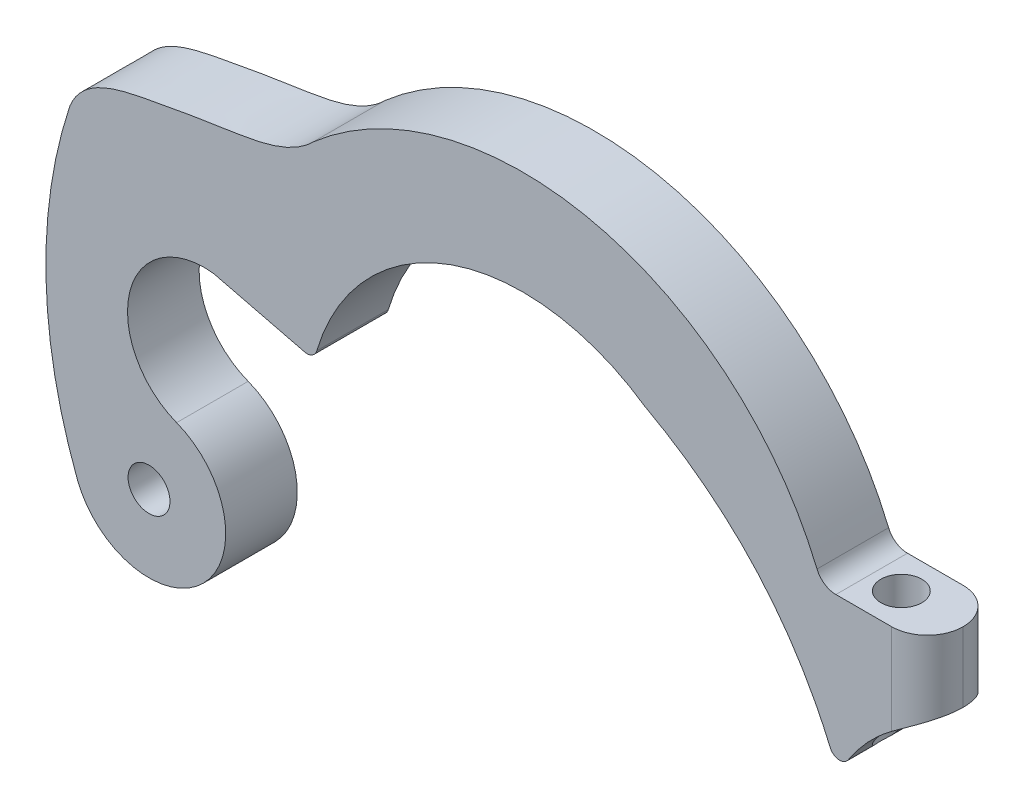
ISO-10303-21;
HEADER;
FILE_DESCRIPTION(('STEP AP214'),'2;1');
FILE_NAME('part.step','',(''),(''),'','','');
FILE_SCHEMA(('AUTOMOTIVE_DESIGN { 1 0 10303 214 1 1 1 1 }'));
ENDSEC;
DATA;
#1=APPLICATION_CONTEXT('core data for automotive mechanical design processes');
#2=APPLICATION_PROTOCOL_DEFINITION('international standard','automotive_design',2000,#1);
#3=PRODUCT_CONTEXT('',#1,'mechanical');
#4=PRODUCT('Part','Part','',(#3));
#5=PRODUCT_RELATED_PRODUCT_CATEGORY('part','',(#4));
#6=PRODUCT_DEFINITION_FORMATION('','',#4);
#7=PRODUCT_DEFINITION_CONTEXT('part definition',#1,'design');
#8=PRODUCT_DEFINITION('design','',#6,#7);
#9=PRODUCT_DEFINITION_SHAPE('','',#8);
#10=(LENGTH_UNIT() NAMED_UNIT(*) SI_UNIT(.MILLI.,.METRE.));
#11=(NAMED_UNIT(*) PLANE_ANGLE_UNIT() SI_UNIT($,.RADIAN.));
#12=(NAMED_UNIT(*) SI_UNIT($,.STERADIAN.) SOLID_ANGLE_UNIT());
#13=UNCERTAINTY_MEASURE_WITH_UNIT(LENGTH_MEASURE(1.E-05),#10,'distance_accuracy_value','');
#14=(GEOMETRIC_REPRESENTATION_CONTEXT(3) GLOBAL_UNCERTAINTY_ASSIGNED_CONTEXT((#13)) GLOBAL_UNIT_ASSIGNED_CONTEXT((#10,
#11,#12)) REPRESENTATION_CONTEXT('',''));
#15=CARTESIAN_POINT('',(0.,0.,0.));
#16=DIRECTION('',(0.,0.,1.));
#17=DIRECTION('',(1.,0.,0.));
#18=AXIS2_PLACEMENT_3D('',#15,#16,#17);
#19=CARTESIAN_POINT('',(17.2001521655852,23.6219728879206,7.));
#20=CARTESIAN_POINT('',(20.0814505358604,29.2897586581277,7.));
#21=CARTESIAN_POINT('',(25.9470319855295,31.9346468589773,7.));
#22=B_SPLINE_CURVE_WITH_KNOTS('',2,(#19,#20,#21),.UNSPECIFIED.,.F.,.F.,(3,3),(0.,1.),.UNSPECIFIED.);
#23=DIRECTION('',(0.,0.,-1.));
#24=VECTOR('',#23,1.);
#25=SURFACE_OF_LINEAR_EXTRUSION('',#22,#24);
#26=CARTESIAN_POINT('',(18.2015927497313,25.3629493457996,7.));
#27=VERTEX_POINT('',#26);
#28=CARTESIAN_POINT('',(22.4470319825975,29.8942588678734,7.));
#29=VERTEX_POINT('',#28);
#30=EDGE_CURVE('E224',#27,#29,#22,.T.);
#31=ORIENTED_EDGE('',*,*,#30,.F.);
#32=DIRECTION('',(0.,0.,-1.));
#33=VECTOR('',#32,1.);
#34=CARTESIAN_POINT('',(18.2015927497313,25.3629493457996,7.));
#35=LINE('',#34,#33);
#36=CARTESIAN_POINT('',(18.2015927497313,25.3629493457996,4.56154111654515));
#37=VERTEX_POINT('',#36);
#38=EDGE_CURVE('E303',#27,#37,#35,.T.);
#39=ORIENTED_EDGE('',*,*,#38,.T.);
#40=CARTESIAN_POINT('',(19.8966238579661,27.5776782801847,5.49999999999994));
#41=CARTESIAN_POINT('',(19.8098926829241,27.4813550935762,5.49999884020681));
#42=CARTESIAN_POINT('',(19.7242840393373,27.3840828251902,5.494369848892));
#43=CARTESIAN_POINT('',(19.5558020947176,27.1882775001092,5.47257673416799));
#44=CARTESIAN_POINT('',(19.4729300030787,27.0897439119877,5.45640801659684));
#45=CARTESIAN_POINT('',(19.3102973129015,26.8920129658044,5.41397424073153));
#46=CARTESIAN_POINT('',(19.230542238776,26.7928147645443,5.38769207907494));
#47=CARTESIAN_POINT('',(19.0747086785046,26.5946873592197,5.32524012173544));
#48=CARTESIAN_POINT('',(18.9986288535112,26.495758069779,5.28907395912586));
#49=CARTESIAN_POINT('',(18.868658179066,26.3230958356867,5.2167934700012));
#50=CARTESIAN_POINT('',(18.8138905650203,26.2491169720247,5.18282892510963));
#51=CARTESIAN_POINT('',(18.7069025780289,26.1022926110442,5.10897152677311));
#52=CARTESIAN_POINT('',(18.6546816873473,26.0294468854325,5.06907988500566));
#53=CARTESIAN_POINT('',(18.5532024831045,25.8856985592782,4.9831152856463));
#54=CARTESIAN_POINT('',(18.5039365737164,25.8147912563204,4.93705925487743));
#55=CARTESIAN_POINT('',(18.408653494581,25.6756270117407,4.8381545249466));
#56=CARTESIAN_POINT('',(18.362634221073,25.6073683669847,4.78531028822642));
#57=CARTESIAN_POINT('',(18.2725395816646,25.4718806292134,4.66959891305477));
#58=CARTESIAN_POINT('',(18.2286315437233,25.4048204399131,4.60639975674109));
#59=CARTESIAN_POINT('',(18.146110520583,25.2771378330396,4.47057378965409));
#60=CARTESIAN_POINT('',(18.1074948341296,25.2165121348473,4.39795182547635));
#61=CARTESIAN_POINT('',(18.0448854667269,25.1171412603727,4.25867576819575));
#62=CARTESIAN_POINT('',(18.0195277124606,25.0764827170088,4.19402392048638));
#63=CARTESIAN_POINT('',(17.9747080337151,25.0041250659171,4.05797773770221));
#64=CARTESIAN_POINT('',(17.9552344487556,24.9724082471149,3.98659711026856));
#65=CARTESIAN_POINT('',(17.9275701737178,24.9271561487168,3.85527490907849));
#66=CARTESIAN_POINT('',(17.9178078204189,24.9111065216248,3.79654272632062));
#67=CARTESIAN_POINT('',(17.9035410571101,24.8876135429762,3.67676440503316));
#68=CARTESIAN_POINT('',(17.8990311319844,24.8801611642783,3.61572076325408));
#69=CARTESIAN_POINT('',(17.8956902931516,24.8746429872509,3.49284959214921));
#70=CARTESIAN_POINT('',(17.896877123769,24.8766065176925,3.43102021259559));
#71=CARTESIAN_POINT('',(17.9048467196601,24.8897596516492,3.30871609741592));
#72=CARTESIAN_POINT('',(17.9116336211601,24.9009560745983,3.24824239702033));
#73=CARTESIAN_POINT('',(17.9320513652866,24.9344984242242,3.11843565398938));
#74=CARTESIAN_POINT('',(17.9467775158678,24.9586231567542,3.04974227017268));
#75=CARTESIAN_POINT('',(17.9820006692961,25.015913947458,2.91784534603719));
#76=CARTESIAN_POINT('',(18.002508618633,25.0490971519208,2.85465251965972));
#77=CARTESIAN_POINT('',(18.0601585346874,25.1415722089247,2.70175200913648));
#78=CARTESIAN_POINT('',(18.1003317991612,25.2053378414466,2.61593085352243));
#79=CARTESIAN_POINT('',(18.1880060658003,25.3422943610519,2.4564781474935));
#80=CARTESIAN_POINT('',(18.2355255591096,25.4155089530351,2.38287835677544));
#81=CARTESIAN_POINT('',(18.3293731746246,25.5576397999015,2.25536498026371));
#82=CARTESIAN_POINT('',(18.3750254503339,25.6258409538296,2.20013511779052));
#83=CARTESIAN_POINT('',(18.4697777076004,25.7652195051312,2.09677873850739));
#84=CARTESIAN_POINT('',(18.5188800711876,25.8363989447988,2.0486572020161));
#85=CARTESIAN_POINT('',(18.6201241064874,25.9808317650666,1.95885365963329));
#86=CARTESIAN_POINT('',(18.6722707555764,26.0540884353259,1.91718263076782));
#87=CARTESIAN_POINT('',(18.7792193540696,26.2018828334888,1.83995269205024));
#88=CARTESIAN_POINT('',(18.8340219105099,26.2764208517222,1.80439518803601));
#89=CARTESIAN_POINT('',(18.9650549516033,26.4516774411645,1.72807418348074));
#90=CARTESIAN_POINT('',(19.0422465241951,26.5526974709972,1.68963817810016));
#91=CARTESIAN_POINT('',(19.2005228619032,26.7551297172021,1.62308410663692));
#92=CARTESIAN_POINT('',(19.281609119316,26.8565420699908,1.5949700317736));
#93=CARTESIAN_POINT('',(19.4471718948321,27.0588506530818,1.54926666534657));
#94=CARTESIAN_POINT('',(19.5316456446983,27.1597472317935,1.5316689596432));
#95=CARTESIAN_POINT('',(19.7035063798126,27.3602866804758,1.50745623760402));
#96=CARTESIAN_POINT('',(19.7908921918074,27.4599300335993,1.50083685145606));
#97=CARTESIAN_POINT('',(20.0131262107082,27.7074800281364,1.49892183386271));
#98=CARTESIAN_POINT('',(20.1495135414186,27.8541635994848,1.51109590293243));
#99=CARTESIAN_POINT('',(20.4243570604005,28.1396513581589,1.56581500055806));
#100=CARTESIAN_POINT('',(20.5628091407869,28.2784690864153,1.60830601134042));
#101=CARTESIAN_POINT('',(20.7995576888863,28.5081862945729,1.71209029475802));
#102=CARTESIAN_POINT('',(20.8986391041876,28.6019320556064,1.76525303162586));
#103=CARTESIAN_POINT('',(21.0916571856414,28.7804994794568,1.8921465364551));
#104=CARTESIAN_POINT('',(21.1856000418898,28.8653319982926,1.96585187481622));
#105=CARTESIAN_POINT('',(21.3443958074552,29.0059148115849,2.11680206659949));
#106=CARTESIAN_POINT('',(21.4111546455624,29.0639925343239,2.18986056326153));
#107=CARTESIAN_POINT('',(21.5355986440519,29.1708059566397,2.34936665832165));
#108=CARTESIAN_POINT('',(21.5932940290087,29.2195521969321,2.43579894781719));
#109=CARTESIAN_POINT('',(21.6880795608943,29.2987964339306,2.60633071419185));
#110=CARTESIAN_POINT('',(21.7269849658425,29.3309606776939,2.68864173182495));
#111=CARTESIAN_POINT('',(21.793884876017,29.3859123330619,2.8605539056587));
#112=CARTESIAN_POINT('',(21.8218837477594,29.4087034974568,2.95015212696756));
#113=CARTESIAN_POINT('',(21.8652957415686,29.4439160032572,3.13480935068443));
#114=CARTESIAN_POINT('',(21.8806490497705,29.456288068156,3.2298920547592));
#115=CARTESIAN_POINT('',(21.897428266481,29.4698049782703,3.42206619153532));
#116=CARTESIAN_POINT('',(21.8988583932892,29.4709532239614,3.51915700690592));
#117=CARTESIAN_POINT('',(21.8881719849134,29.4623494405819,3.70391823669822));
#118=CARTESIAN_POINT('',(21.8771742760756,29.453497688628,3.79169950916133));
#119=CARTESIAN_POINT('',(21.8440982300006,29.4267387259904,3.96369525385861));
#120=CARTESIAN_POINT('',(21.822020028104,29.4088316259115,4.04790976964466));
#121=CARTESIAN_POINT('',(21.7675596771128,29.3643320204434,4.21219571078722));
#122=CARTESIAN_POINT('',(21.7350055126082,29.3375943084381,4.29216998604148));
#123=CARTESIAN_POINT('',(21.6613635305606,29.2765286173168,4.44493009916874));
#124=CARTESIAN_POINT('',(21.6202732207643,29.2421984212738,4.51771382847787));
#125=CARTESIAN_POINT('',(21.5258081385958,29.1623836966997,4.66370959958499));
#126=CARTESIAN_POINT('',(21.4715442890915,29.1160468858402,4.73587523278912));
#127=CARTESIAN_POINT('',(21.3566344463599,29.0165064858546,4.86973290128619));
#128=CARTESIAN_POINT('',(21.2959793484576,28.9632930755487,4.93140965878472));
#129=CARTESIAN_POINT('',(21.1849362989382,28.8643508018315,5.03116108172517));
#130=CARTESIAN_POINT('',(21.1354398479284,28.8197581302734,5.07138926888604));
#131=CARTESIAN_POINT('',(21.0346479702629,28.7278298527731,5.14585040693285));
#132=CARTESIAN_POINT('',(20.9833540651065,28.6804965455777,5.18008828803301));
#133=CARTESIAN_POINT('',(20.8274480996093,28.5347756655496,5.27435522546337));
#134=CARTESIAN_POINT('',(20.7209502800146,28.4327897382292,5.32581767506901));
#135=CARTESIAN_POINT('',(20.4936537304065,28.2091531754158,5.41315985382582));
#136=CARTESIAN_POINT('',(20.3727120631309,28.0866289545604,5.44633280788809));
#137=CARTESIAN_POINT('',(20.1327065537732,27.8358733189006,5.48975822332967));
#138=CARTESIAN_POINT('',(20.013643477559,27.7076396539288,5.50000156481848));
#139=CARTESIAN_POINT('',(19.8966238579661,27.5776782801847,5.49999999999994));
#140=B_SPLINE_CURVE_WITH_KNOTS('',3,(#40,#41,#42,#43,#44,#45,#46,#47,#48,#49,#50,#51,#52,#53,
#54,#55,#56,#57,#58,#59,#60,#61,#62,#63,#64,#65,#66,#67,#68,#69,#70,#71,#72,#73,#74,#75,#76,#77,
#78,#79,#80,#81,#82,#83,#84,#85,#86,#87,#88,#89,#90,#91,#92,#93,#94,#95,#96,#97,#98,#99,#100,
#101,#102,#103,#104,#105,#106,#107,#108,#109,#110,#111,#112,#113,#114,#115,#116,#117,#118,#119,
#120,#121,#122,#123,#124,#125,#126,#127,#128,#129,#130,#131,#132,#133,#134,#135,#136,#137,#138,
#139),.UNSPECIFIED.,.T.,.F.,(4,2,2,2,2,2,2,2,2,2,2,2,2,2,2,2,2,2,2,2,2,2,2,2,2,2,2,2,2,2,2,2,2,
2,2,2,2,2,2,2,2,2,2,2,2,2,2,2,2,4),(0.,0.388659282770202,0.777488091646844,1.16697737941653,
1.55632369427737,1.85046526822323,2.14454679327757,2.4378367597651,2.73093490015948,
3.03656910823861,3.34204673278144,3.58271989457953,3.82291294563747,4.0071464351827,
4.19118630233214,4.3757997904351,4.56054975671111,4.78216011423593,5.0041928899157,
5.34493001872175,5.68653921522483,5.98290200360533,6.27947145820034,6.57654017361641,
6.8736771104781,7.27163810976643,7.66975282845396,8.06754858787444,8.46518597056992,
9.06502155888429,9.66379103945124,10.1015197676678,10.5387090217714,10.8816753621772,
11.2242519764011,11.5127104284992,11.8010532750072,12.0907522831789,12.3803635186456,
12.6458433291068,12.911319896992,13.1813993649301,13.4515577976525,13.7549139503303,
14.0587082470938,14.2918733341028,14.5248456066793,14.9914431022406,15.5156223555133,
16.040010055772),.UNSPECIFIED.);
#141=CARTESIAN_POINT('',(18.2015927497313,25.3629493457996,2.43845888345488));
#142=VERTEX_POINT('',#141);
#143=EDGE_CURVE('E230',#142,#37,#140,.T.);
#144=ORIENTED_EDGE('',*,*,#143,.F.);
#145=DIRECTION('',(0.,0.,-1.));
#146=VECTOR('',#145,1.);
#147=CARTESIAN_POINT('',(18.2015927497313,25.3629493457996,7.));
#148=LINE('',#147,#146);
#149=CARTESIAN_POINT('',(18.2015927497313,25.3629493457996,0.));
#150=VERTEX_POINT('',#149);
#151=EDGE_CURVE('E301',#142,#150,#148,.T.);
#152=ORIENTED_EDGE('',*,*,#151,.T.);
#153=CARTESIAN_POINT('',(17.2001521655852,23.6219728879206,0.));
#154=CARTESIAN_POINT('',(20.0814505358604,29.2897586581277,0.));
#155=CARTESIAN_POINT('',(25.9470319855295,31.9346468589773,0.));
#156=B_SPLINE_CURVE_WITH_KNOTS('',2,(#153,#154,#155),.UNSPECIFIED.,.F.,.F.,(3,3),(0.,1.),.UNSPECIFIED.);
#157=CARTESIAN_POINT('',(22.4470319825975,29.8942588678734,0.));
#158=VERTEX_POINT('',#157);
#159=EDGE_CURVE('E351',#150,#158,#156,.T.);
#160=ORIENTED_EDGE('',*,*,#159,.T.);
#161=CARTESIAN_POINT('',(22.4470319855295,29.8942588639167,0.));
#162=CARTESIAN_POINT('',(22.5665554976981,29.9828795206211,-5.56647734688034E-06));
#163=CARTESIAN_POINT('',(22.6872843484666,30.0699946104767,0.00612461249474137));
#164=CARTESIAN_POINT('',(22.9301708367813,30.2407265825517,0.0313539204566733));
#165=CARTESIAN_POINT('',(23.0523306616043,30.3243368603296,0.0504764600029265));
#166=CARTESIAN_POINT('',(23.2971482356552,30.4875750492338,0.102497350988091));
#167=CARTESIAN_POINT('',(23.4198060104082,30.5671855810638,0.135450827783652));
#168=CARTESIAN_POINT('',(23.6634970103085,30.7213447167459,0.215697210156675));
#169=CARTESIAN_POINT('',(23.7845315714496,30.795897718253,0.262977457450226));
#170=CARTESIAN_POINT('',(23.9896542660832,30.919155522692,0.356877052466896));
#171=CARTESIAN_POINT('',(24.0745587302664,30.9692324441137,0.399941646130459));
#172=CARTESIAN_POINT('',(24.2418942613739,31.0662324165186,0.493729391709691));
#173=CARTESIAN_POINT('',(24.3243258780141,31.1131561713729,0.544450826151649));
#174=CARTESIAN_POINT('',(24.48576344269,31.2035399729088,0.653416333201437));
#175=CARTESIAN_POINT('',(24.5647761255619,31.2470069851313,0.711644624349409));
#176=CARTESIAN_POINT('',(24.7186903548014,31.3303606858652,0.835544576196664));
#177=CARTESIAN_POINT('',(24.7935938254376,31.3702490558464,0.901212708024677));
#178=CARTESIAN_POINT('',(24.9389460281684,31.446527577507,1.04021520638064));
#179=CARTESIAN_POINT('',(25.0093627593528,31.4828933939603,1.11359647883229));
#180=CARTESIAN_POINT('',(25.1443078165034,31.5516480474322,1.26725442575238));
#181=CARTESIAN_POINT('',(25.2088387157219,31.5840386245638,1.34752805683152));
#182=CARTESIAN_POINT('',(25.3312557900454,31.6447440319733,1.51455710485005));
#183=CARTESIAN_POINT('',(25.3891360852498,31.6730552611689,1.60131814724438));
#184=CARTESIAN_POINT('',(25.4973844000389,31.7254462401881,1.78060709870666));
#185=CARTESIAN_POINT('',(25.5477534424748,31.7495265662385,1.87313422013631));
#186=CARTESIAN_POINT('',(25.6357853198476,31.7912411475059,2.05398262167136));
#187=CARTESIAN_POINT('',(25.6742061395618,31.8092737402666,2.14184405414431));
#188=CARTESIAN_POINT('',(25.743878111223,31.8417593441568,2.32100017802681));
#189=CARTESIAN_POINT('',(25.7751300174297,31.8562127318764,2.41229450707505));
#190=CARTESIAN_POINT('',(25.8300393517409,31.8814805806018,2.59746320700012));
#191=CARTESIAN_POINT('',(25.8537091290955,31.8923009602004,2.691333109379));
#192=CARTESIAN_POINT('',(25.8932220579867,31.9103034448264,2.88100764411741));
#193=CARTESIAN_POINT('',(25.9090691984939,31.917487404209,2.97681126442575));
#194=CARTESIAN_POINT('',(25.9296063175659,31.9267821319608,3.14396438681614));
#195=CARTESIAN_POINT('',(25.9361421056709,31.9297337326443,3.21504694174019));
#196=CARTESIAN_POINT('',(25.9448534568388,31.9336645119566,3.35741717964341));
#197=CARTESIAN_POINT('',(25.9470360677028,31.9346468787911,3.42870434362669));
#198=CARTESIAN_POINT('',(25.9470319855295,31.9346468589773,3.5));
#199=B_SPLINE_CURVE_WITH_KNOTS('',3,(#161,#162,#163,#164,#165,#166,#167,#168,#169,#170,#171,
#172,#173,#174,#175,#176,#177,#178,#179,#180,#181,#182,#183,#184,#185,#186,#187,#188,#189,#190,
#191,#192,#193,#194,#195,#196,#197,#198),.UNSPECIFIED.,.F.,.F.,(4,2,2,2,2,2,2,2,2,2,2,2,2,2,2,2,
2,2,4),(0.,0.446350824528992,0.893508056072512,1.34246468550038,1.79102579442959,
2.11341714689362,2.4357362922668,2.75738855953018,3.07888889416988,3.40247189781508,
3.72591274783152,4.0496373916404,4.37331791163713,4.6656668246653,4.95798496479263,
5.24982454745425,5.54151515921833,5.75569247373219,5.96952275244164),.UNSPECIFIED.);
#200=CARTESIAN_POINT('',(25.9470319855295,31.9346468589773,3.5));
#201=VERTEX_POINT('',#200);
#202=EDGE_CURVE('E253',#158,#201,#199,.T.);
#203=ORIENTED_EDGE('',*,*,#202,.T.);
#204=CARTESIAN_POINT('',(25.9470319855295,31.9346468589773,3.5));
#205=CARTESIAN_POINT('',(25.9470461280311,31.9346480945641,3.59135616251538));
#206=CARTESIAN_POINT('',(25.9434557677776,31.9330341251254,3.68270902129284));
#207=CARTESIAN_POINT('',(25.9291693110547,31.9265851411146,3.86472579277713));
#208=CARTESIAN_POINT('',(25.918474582044,31.921750746414,3.95538983467226));
#209=CARTESIAN_POINT('',(25.8901179656057,31.9088863219072,4.13515799965357));
#210=CARTESIAN_POINT('',(25.8724735093792,31.9008642868504,4.22426544744259));
#211=CARTESIAN_POINT('',(25.8304133182699,31.8816419673842,4.40052109466693));
#212=CARTESIAN_POINT('',(25.8059972362911,31.8704415200568,4.48766919342348));
#213=CARTESIAN_POINT('',(25.7506574028257,31.8448884510903,4.65939521872141));
#214=CARTESIAN_POINT('',(25.7197338067114,31.8305359047097,4.7439732065711));
#215=CARTESIAN_POINT('',(25.6517147355872,31.798716975974,4.90998404931584));
#216=CARTESIAN_POINT('',(25.6146202136018,31.7812510744089,4.99141738747468));
#217=CARTESIAN_POINT('',(25.5346376640202,31.7432473887582,5.15064390907123));
#218=CARTESIAN_POINT('',(25.491749598767,31.7227095847057,5.228437068844));
#219=CARTESIAN_POINT('',(25.4006030653896,31.6786140414463,5.37996046651562));
#220=CARTESIAN_POINT('',(25.3523410076792,31.6550542820932,5.45368793896693));
#221=CARTESIAN_POINT('',(25.1978428934396,31.5787783305809,5.67143534668671));
#222=CARTESIAN_POINT('',(25.0837456750075,31.5213300777107,5.80836292810864));
#223=CARTESIAN_POINT('',(24.839397083887,31.3948031523493,6.06076087409481));
#224=CARTESIAN_POINT('',(24.7091357334685,31.3257172867399,6.17621787442759));
#225=CARTESIAN_POINT('',(24.4999498765983,31.2113377942515,6.33620329110977));
#226=CARTESIAN_POINT('',(24.4250702171276,31.1697743088706,6.38887834765963));
#227=CARTESIAN_POINT('',(24.2726871030907,31.0837809921423,6.48750803592483));
#228=CARTESIAN_POINT('',(24.19518623949,31.0393539541061,6.53346907814828));
#229=CARTESIAN_POINT('',(24.0379868144756,30.9476933640541,6.61879478009944));
#230=CARTESIAN_POINT('',(23.9582840053371,30.9004541501809,6.65814547773572));
#231=CARTESIAN_POINT('',(23.7974140851099,30.8034326294983,6.73020721818906));
#232=CARTESIAN_POINT('',(23.7162465807362,30.7536496328829,6.76291644792888));
#233=CARTESIAN_POINT('',(23.5359469998773,30.6410893822705,6.82795248535166));
#234=CARTESIAN_POINT('',(23.4366063814197,30.5777711814764,6.85877008801705));
#235=CARTESIAN_POINT('',(23.2374668539806,30.4480561469204,6.91113146379967));
#236=CARTESIAN_POINT('',(23.137667813159,30.3816583701002,6.93267237506795));
#237=CARTESIAN_POINT('',(22.9387556148956,30.2463958896681,6.96674979196393));
#238=CARTESIAN_POINT('',(22.8396412815381,30.1775409155486,6.97931839834202));
#239=CARTESIAN_POINT('',(22.6424362388268,30.0375420410932,6.99594074170432));
#240=CARTESIAN_POINT('',(22.5443447578236,29.9664000609687,7.00000144179864));
#241=CARTESIAN_POINT('',(22.4470319829132,29.8942588681074,7.));
#242=B_SPLINE_CURVE_WITH_KNOTS('',3,(#204,#205,#206,#207,#208,#209,#210,#211,#212,#213,#214,
#215,#216,#217,#218,#219,#220,#221,#222,#223,#224,#225,#226,#227,#228,#229,#230,#231,#232,#233,
#234,#235,#236,#237,#238,#239,#240,#241),.UNSPECIFIED.,.F.,.F.,(4,2,2,2,2,2,2,2,2,2,2,2,2,2,2,2,
2,2,4),(0.,0.273978714324463,0.547904708120585,0.821147975825001,1.094405251862,
1.36765600440066,1.64086459579964,1.9140749630918,2.18746892997172,2.74667613330865,
3.30623025512171,3.60760339866438,3.90868688499102,4.21039852207887,4.51219241405476,
4.87707211389954,5.24206429822885,5.6057439930229,5.96912592565886),.UNSPECIFIED.);
#243=EDGE_CURVE('E266',#201,#29,#242,.T.);
#244=ORIENTED_EDGE('',*,*,#243,.T.);
#245=EDGE_LOOP('',(#31,#39,#144,#152,#160,#203,#244));
#246=FACE_BOUND('',#245,.T.);
#247=ADVANCED_FACE('F46',(#246),#25,.F.);
#248=CARTESIAN_POINT('',(0.,38.7608488072893,7.));
#249=DIRECTION('',(0.,1.,0.));
#250=DIRECTION('',(0.,0.,1.));
#251=AXIS2_PLACEMENT_3D('',#248,#249,#250);
#252=PLANE('',#251);
#253=CARTESIAN_POINT('',(19.8966238579661,38.7608488072893,3.50000000000001));
#254=DIRECTION('',(0.,1.,0.));
#255=DIRECTION('',(0.,0.,1.));
#256=AXIS2_PLACEMENT_3D('',#253,#254,#255);
#257=CIRCLE('',#256,1.99999999999993);
#258=CARTESIAN_POINT('',(19.8966238579661,38.7608488072893,5.49999999999994));
#259=VERTEX_POINT('',#258);
#260=EDGE_CURVE('E427',#259,#259,#257,.F.);
#261=ORIENTED_EDGE('',*,*,#260,.T.);
#262=EDGE_LOOP('',(#261));
#263=FACE_BOUND('',#262,.T.);
#264=DIRECTION('',(1.,0.,0.));
#265=VECTOR('',#264,1.);
#266=CARTESIAN_POINT('',(0.,38.7608488072893,0.));
#267=LINE('',#266,#265);
#268=CARTESIAN_POINT('',(16.9973650923728,38.7608488072893,0.));
#269=VERTEX_POINT('',#268);
#270=CARTESIAN_POINT('',(22.4470319855295,38.7608488072893,0.));
#271=VERTEX_POINT('',#270);
#272=EDGE_CURVE('E355',#269,#271,#267,.T.);
#273=ORIENTED_EDGE('',*,*,#272,.F.);
#274=DIRECTION('',(0.,0.,1.));
#275=VECTOR('',#274,1.);
#276=CARTESIAN_POINT('',(16.9973650923728,38.7608488072893,7.));
#277=LINE('',#276,#275);
#278=CARTESIAN_POINT('',(16.9973650923728,38.7608488072893,7.));
#279=VERTEX_POINT('',#278);
#280=EDGE_CURVE('E245',#269,#279,#277,.T.);
#281=ORIENTED_EDGE('',*,*,#280,.T.);
#282=DIRECTION('',(1.,0.,0.));
#283=VECTOR('',#282,1.);
#284=CARTESIAN_POINT('',(0.,38.7608488072893,7.));
#285=LINE('',#284,#283);
#286=CARTESIAN_POINT('',(22.4470319855295,38.7608488072893,7.));
#287=VERTEX_POINT('',#286);
#288=EDGE_CURVE('E186',#279,#287,#285,.T.);
#289=ORIENTED_EDGE('',*,*,#288,.T.);
#290=CARTESIAN_POINT('',(22.4470319855295,38.7608488072893,3.5));
#291=DIRECTION('',(0.,1.,0.));
#292=DIRECTION('',(0.,0.,1.));
#293=AXIS2_PLACEMENT_3D('',#290,#291,#292);
#294=CIRCLE('',#293,3.5);
#295=CARTESIAN_POINT('',(25.9470319855295,38.7608488072893,3.5));
#296=VERTEX_POINT('',#295);
#297=EDGE_CURVE('E173',#287,#296,#294,.T.);
#298=ORIENTED_EDGE('',*,*,#297,.T.);
#299=CARTESIAN_POINT('',(22.4470319855295,38.7608488072893,3.5));
#300=DIRECTION('',(0.,1.,0.));
#301=DIRECTION('',(0.,0.,1.));
#302=AXIS2_PLACEMENT_3D('',#299,#300,#301);
#303=CIRCLE('',#302,3.5);
#304=EDGE_CURVE('E259',#296,#271,#303,.T.);
#305=ORIENTED_EDGE('',*,*,#304,.T.);
#306=EDGE_LOOP('',(#273,#281,#289,#298,#305));
#307=FACE_BOUND('',#306,.T.);
#308=ADVANCED_FACE('F209',(#263,#307),#252,.T.);
#309=CARTESIAN_POINT('',(-13.629752375995,28.0761266747868,7.));
#310=DIRECTION('',(0.,0.,-1.));
#311=DIRECTION('',(-1.,0.,0.));
#312=AXIS2_PLACEMENT_3D('',#309,#310,#311);
#313=CYLINDRICAL_SURFACE('',#312,31.15);
#314=CARTESIAN_POINT('',(-13.629752375995,28.0761266747868,7.));
#315=DIRECTION('',(0.,0.,1.));
#316=DIRECTION('',(1.,0.,0.));
#317=AXIS2_PLACEMENT_3D('',#314,#315,#316);
#318=CIRCLE('',#317,31.15);
#319=CARTESIAN_POINT('',(-34.1005464957736,51.5552469331279,7.));
#320=VERTEX_POINT('',#319);
#321=CARTESIAN_POINT('',(15.1495751998619,39.9955563709392,7.));
#322=VERTEX_POINT('',#321);
#323=EDGE_CURVE('E165',#320,#322,#318,.F.);
#324=ORIENTED_EDGE('',*,*,#323,.T.);
#325=DIRECTION('',(0.,0.,-1.));
#326=VECTOR('',#325,1.);
#327=CARTESIAN_POINT('',(15.1495751998619,39.9955563709392,7.));
#328=LINE('',#327,#326);
#329=CARTESIAN_POINT('',(15.1495751998619,39.9955563709392,0.));
#330=VERTEX_POINT('',#329);
#331=EDGE_CURVE('E252',#322,#330,#328,.T.);
#332=ORIENTED_EDGE('',*,*,#331,.T.);
#333=CARTESIAN_POINT('',(-13.629752375995,28.0761266747868,0.));
#334=DIRECTION('',(0.,0.,1.));
#335=DIRECTION('',(1.,0.,0.));
#336=AXIS2_PLACEMENT_3D('',#333,#334,#335);
#337=CIRCLE('',#336,31.15);
#338=CARTESIAN_POINT('',(-34.1005464957736,51.5552469331279,0.));
#339=VERTEX_POINT('',#338);
#340=EDGE_CURVE('E168',#339,#330,#337,.F.);
#341=ORIENTED_EDGE('',*,*,#340,.F.);
#342=DIRECTION('',(0.,0.,-1.));
#343=VECTOR('',#342,1.);
#344=CARTESIAN_POINT('',(-34.1005464957736,51.5552469331279,7.));
#345=LINE('',#344,#343);
#346=EDGE_CURVE('E161',#320,#339,#345,.T.);
#347=ORIENTED_EDGE('',*,*,#346,.F.);
#348=EDGE_LOOP('',(#324,#332,#341,#347));
#349=FACE_BOUND('',#348,.T.);
#350=ADVANCED_FACE('F163',(#349),#313,.T.);
#351=CARTESIAN_POINT('',(-57.9243800577415,42.6666077393479,7.));
#352=CARTESIAN_POINT('',(-56.7015912312199,45.7714848220794,7.));
#353=CARTESIAN_POINT('',(-50.422513983906,47.0662869906637,7.));
#354=CARTESIAN_POINT('',(-42.4716040268451,48.4479295702209,7.));
#355=CARTESIAN_POINT('',(-36.4565724769111,49.1829255356011,7.));
#356=CARTESIAN_POINT('',(-34.1005464957736,51.5552469331278,7.));
#357=B_SPLINE_CURVE_WITH_KNOTS('',3,(#351,#352,#353,#354,#355,#356),.UNSPECIFIED.,.F.,.F.,(4,1,
1,4),(0.,0.347094868158732,0.63127745787504,1.),.UNSPECIFIED.);
#358=DIRECTION('',(0.,0.,-1.));
#359=VECTOR('',#358,1.);
#360=SURFACE_OF_LINEAR_EXTRUSION('',#357,#359);
#361=CARTESIAN_POINT('',(-57.9243800577415,42.6666077393479,0.));
#362=CARTESIAN_POINT('',(-56.7015912312199,45.7714848220794,0.));
#363=CARTESIAN_POINT('',(-50.422513983906,47.0662869906637,0.));
#364=CARTESIAN_POINT('',(-42.4716040268451,48.4479295702209,0.));
#365=CARTESIAN_POINT('',(-36.4565724769111,49.1829255356011,0.));
#366=CARTESIAN_POINT('',(-34.1005464957736,51.5552469331278,0.));
#367=B_SPLINE_CURVE_WITH_KNOTS('',3,(#361,#362,#363,#364,#365,#366),.UNSPECIFIED.,.F.,.F.,(4,1,
1,4),(0.,0.347094868158732,0.63127745787504,1.),.UNSPECIFIED.);
#368=CARTESIAN_POINT('',(-57.9243800577415,42.6666077393479,0.));
#369=VERTEX_POINT('',#368);
#370=EDGE_CURVE('E360',#369,#339,#367,.T.);
#371=ORIENTED_EDGE('',*,*,#370,.F.);
#372=DIRECTION('',(0.,0.,-1.));
#373=VECTOR('',#372,1.);
#374=CARTESIAN_POINT('',(-57.9243800577415,42.6666077393479,7.));
#375=LINE('',#374,#373);
#376=CARTESIAN_POINT('',(-57.9243800577415,42.6666077393479,7.));
#377=VERTEX_POINT('',#376);
#378=EDGE_CURVE('E174',#377,#369,#375,.T.);
#379=ORIENTED_EDGE('',*,*,#378,.F.);
#380=EDGE_CURVE('E181',#377,#320,#357,.T.);
#381=ORIENTED_EDGE('',*,*,#380,.T.);
#382=ORIENTED_EDGE('',*,*,#346,.T.);
#383=EDGE_LOOP('',(#371,#379,#381,#382));
#384=FACE_BOUND('',#383,.T.);
#385=ADVANCED_FACE('F188',(#384),#360,.T.);
#386=CARTESIAN_POINT('',(-13.629752375995,28.0761266747868,7.));
#387=DIRECTION('',(0.,0.,-1.));
#388=DIRECTION('',(-1.,0.,0.));
#389=AXIS2_PLACEMENT_3D('',#386,#387,#388);
#390=CYLINDRICAL_SURFACE('',#389,46.63578217592);
#391=CARTESIAN_POINT('',(-13.629752375995,28.0761266747868,0.));
#392=DIRECTION('',(0.,0.,1.));
#393=DIRECTION('',(1.,0.,0.));
#394=AXIS2_PLACEMENT_3D('',#391,#392,#393);
#395=CIRCLE('',#394,46.63578217592);
#396=CARTESIAN_POINT('',(-57.1816668695043,11.3989889374557,0.));
#397=VERTEX_POINT('',#396);
#398=EDGE_CURVE('E365',#397,#369,#395,.F.);
#399=ORIENTED_EDGE('',*,*,#398,.F.);
#400=DIRECTION('',(0.,0.,-1.));
#401=VECTOR('',#400,1.);
#402=CARTESIAN_POINT('',(-57.1816668695043,11.3989889374557,7.));
#403=LINE('',#402,#401);
#404=CARTESIAN_POINT('',(-57.1816668695043,11.3989889374557,7.));
#405=VERTEX_POINT('',#404);
#406=EDGE_CURVE('E398',#405,#397,#403,.T.);
#407=ORIENTED_EDGE('',*,*,#406,.F.);
#408=CARTESIAN_POINT('',(-13.629752375995,28.0761266747868,7.));
#409=DIRECTION('',(0.,0.,1.));
#410=DIRECTION('',(1.,0.,0.));
#411=AXIS2_PLACEMENT_3D('',#408,#409,#410);
#412=CIRCLE('',#411,46.63578217592);
#413=EDGE_CURVE('E189',#405,#377,#412,.F.);
#414=ORIENTED_EDGE('',*,*,#413,.T.);
#415=ORIENTED_EDGE('',*,*,#378,.T.);
#416=EDGE_LOOP('',(#399,#407,#414,#415));
#417=FACE_BOUND('',#416,.T.);
#418=ADVANCED_FACE('F205',(#417),#390,.T.);
#419=CARTESIAN_POINT('',(-50.1776166861243,14.0810182118477,7.));
#420=DIRECTION('',(0.,0.,-1.));
#421=DIRECTION('',(-1.,0.,0.));
#422=AXIS2_PLACEMENT_3D('',#419,#420,#421);
#423=CYLINDRICAL_SURFACE('',#422,7.5);
#424=CARTESIAN_POINT('',(-50.1776166861243,14.0810182118477,0.));
#425=DIRECTION('',(0.,0.,1.));
#426=DIRECTION('',(1.,0.,0.));
#427=AXIS2_PLACEMENT_3D('',#424,#425,#426);
#428=CIRCLE('',#427,7.5);
#429=CARTESIAN_POINT('',(-47.4786845310597,21.0785724433173,0.));
#430=VERTEX_POINT('',#429);
#431=EDGE_CURVE('E371',#430,#397,#428,.F.);
#432=ORIENTED_EDGE('',*,*,#431,.F.);
#433=DIRECTION('',(0.,0.,-1.));
#434=VECTOR('',#433,1.);
#435=CARTESIAN_POINT('',(-47.4786845310597,21.0785724433173,7.));
#436=LINE('',#435,#434);
#437=CARTESIAN_POINT('',(-47.4786845310597,21.0785724433173,7.));
#438=VERTEX_POINT('',#437);
#439=EDGE_CURVE('E396',#438,#430,#436,.T.);
#440=ORIENTED_EDGE('',*,*,#439,.F.);
#441=CARTESIAN_POINT('',(-50.1776166861243,14.0810182118477,7.));
#442=DIRECTION('',(0.,0.,1.));
#443=DIRECTION('',(1.,0.,0.));
#444=AXIS2_PLACEMENT_3D('',#441,#442,#443);
#445=CIRCLE('',#444,7.5);
#446=EDGE_CURVE('E191',#438,#405,#445,.F.);
#447=ORIENTED_EDGE('',*,*,#446,.T.);
#448=ORIENTED_EDGE('',*,*,#406,.T.);
#449=EDGE_LOOP('',(#432,#440,#447,#448));
#450=FACE_BOUND('',#449,.T.);
#451=ADVANCED_FACE('F406',(#450),#423,.T.);
#452=CARTESIAN_POINT('',(-44.779752375995,28.0761266747868,7.));
#453=DIRECTION('',(0.,0.,-1.));
#454=DIRECTION('',(-1.,0.,0.));
#455=AXIS2_PLACEMENT_3D('',#452,#453,#454);
#456=CYLINDRICAL_SURFACE('',#455,7.49999999999999);
#457=CARTESIAN_POINT('',(-44.779752375995,28.0761266747868,0.));
#458=DIRECTION('',(0.,0.,1.));
#459=DIRECTION('',(1.,0.,0.));
#460=AXIS2_PLACEMENT_3D('',#457,#458,#459);
#461=CIRCLE('',#460,7.49999999999999);
#462=CARTESIAN_POINT('',(-43.8768631304091,35.5215810605316,0.));
#463=VERTEX_POINT('',#462);
#464=EDGE_CURVE('E374',#430,#463,#461,.F.);
#465=ORIENTED_EDGE('',*,*,#464,.T.);
#466=DIRECTION('',(0.,0.,-1.));
#467=VECTOR('',#466,1.);
#468=CARTESIAN_POINT('',(-43.8768631304091,35.5215810605316,7.));
#469=LINE('',#468,#467);
#470=CARTESIAN_POINT('',(-43.8768631304091,35.5215810605316,7.));
#471=VERTEX_POINT('',#470);
#472=EDGE_CURVE('E393',#471,#463,#469,.T.);
#473=ORIENTED_EDGE('',*,*,#472,.F.);
#474=CARTESIAN_POINT('',(-44.779752375995,28.0761266747868,7.));
#475=DIRECTION('',(0.,0.,1.));
#476=DIRECTION('',(1.,0.,0.));
#477=AXIS2_PLACEMENT_3D('',#474,#475,#476);
#478=CIRCLE('',#477,7.49999999999999);
#479=EDGE_CURVE('E410',#438,#471,#478,.F.);
#480=ORIENTED_EDGE('',*,*,#479,.F.);
#481=ORIENTED_EDGE('',*,*,#439,.T.);
#482=EDGE_LOOP('',(#465,#473,#480,#481));
#483=FACE_BOUND('',#482,.T.);
#484=ADVANCED_FACE('F439',(#483),#456,.F.);
#485=CARTESIAN_POINT('',(5.73755535266974,23.3087818715345,7.));
#486=DIRECTION('',(0.239019402431612,0.971014791473969,0.));
#487=DIRECTION('',(-0.971014791473969,0.239019402431612,0.));
#488=AXIS2_PLACEMENT_3D('',#485,#486,#487);
#489=PLANE('',#488);
#490=DIRECTION('',(0.971014791473969,-0.239019402431612,0.));
#491=VECTOR('',#490,1.);
#492=CARTESIAN_POINT('',(5.73755535266974,23.3087818715345,0.));
#493=LINE('',#492,#491);
#494=CARTESIAN_POINT('',(-34.9699978596153,33.3291184603147,0.));
#495=VERTEX_POINT('',#494);
#496=EDGE_CURVE('E376',#463,#495,#493,.T.);
#497=ORIENTED_EDGE('',*,*,#496,.T.);
#498=DIRECTION('',(0.,0.,-1.));
#499=VECTOR('',#498,1.);
#500=CARTESIAN_POINT('',(-34.9699978596153,33.3291184603147,7.));
#501=LINE('',#500,#499);
#502=CARTESIAN_POINT('',(-34.9699978596153,33.3291184603147,7.));
#503=VERTEX_POINT('',#502);
#504=EDGE_CURVE('E296',#495,#503,#501,.F.);
#505=ORIENTED_EDGE('',*,*,#504,.T.);
#506=DIRECTION('',(0.971014791473969,-0.239019402431612,0.));
#507=VECTOR('',#506,1.);
#508=CARTESIAN_POINT('',(5.73755535266974,23.3087818715345,7.));
#509=LINE('',#508,#507);
#510=EDGE_CURVE('E412',#471,#503,#509,.T.);
#511=ORIENTED_EDGE('',*,*,#510,.F.);
#512=ORIENTED_EDGE('',*,*,#472,.T.);
#513=EDGE_LOOP('',(#497,#505,#511,#512));
#514=FACE_BOUND('',#513,.T.);
#515=ADVANCED_FACE('F437',(#514),#489,.F.);
#516=CARTESIAN_POINT('',(-13.629752375995,28.0761266747868,7.));
#517=DIRECTION('',(0.,0.,-1.));
#518=DIRECTION('',(-1.,0.,0.));
#519=AXIS2_PLACEMENT_3D('',#516,#517,#518);
#520=CYLINDRICAL_SURFACE('',#519,21.);
#521=CARTESIAN_POINT('',(-13.629752375995,28.0761266747868,7.));
#522=DIRECTION('',(0.,0.,1.));
#523=DIRECTION('',(1.,0.,0.));
#524=AXIS2_PLACEMENT_3D('',#521,#522,#523);
#525=CIRCLE('',#524,21.);
#526=CARTESIAN_POINT('',(-33.7718318171297,34.017223861925,7.));
#527=VERTEX_POINT('',#526);
#528=CARTESIAN_POINT('',(-1.70916345782241,45.3648385945321,7.));
#529=VERTEX_POINT('',#528);
#530=EDGE_CURVE('E343',#527,#529,#525,.F.);
#531=ORIENTED_EDGE('',*,*,#530,.F.);
#532=DIRECTION('',(0.,0.,-1.));
#533=VECTOR('',#532,1.);
#534=CARTESIAN_POINT('',(-33.7718318171297,34.017223861925,7.));
#535=LINE('',#534,#533);
#536=CARTESIAN_POINT('',(-33.7718318171297,34.017223861925,0.));
#537=VERTEX_POINT('',#536);
#538=EDGE_CURVE('E298',#527,#537,#535,.T.);
#539=ORIENTED_EDGE('',*,*,#538,.T.);
#540=CARTESIAN_POINT('',(-13.629752375995,28.0761266747868,0.));
#541=DIRECTION('',(0.,0.,1.));
#542=DIRECTION('',(1.,0.,0.));
#543=AXIS2_PLACEMENT_3D('',#540,#541,#542);
#544=CIRCLE('',#543,21.);
#545=CARTESIAN_POINT('',(-1.70916345782241,45.3648385945321,0.));
#546=VERTEX_POINT('',#545);
#547=EDGE_CURVE('E379',#537,#546,#544,.F.);
#548=ORIENTED_EDGE('',*,*,#547,.T.);
#549=DIRECTION('',(0.,0.,-1.));
#550=VECTOR('',#549,1.);
#551=CARTESIAN_POINT('',(-1.70916345782241,45.3648385945321,7.));
#552=LINE('',#551,#550);
#553=EDGE_CURVE('E350',#529,#546,#552,.T.);
#554=ORIENTED_EDGE('',*,*,#553,.F.);
#555=EDGE_LOOP('',(#531,#539,#548,#554));
#556=FACE_BOUND('',#555,.T.);
#557=ADVANCED_FACE('F334',(#556),#520,.F.);
#558=CARTESIAN_POINT('',(-1.70916345782243,45.3648385945321,7.));
#559=CARTESIAN_POINT('',(11.7764423460906,38.0829476168065,7.));
#560=CARTESIAN_POINT('',(17.2001521655852,23.6219728879206,7.));
#561=B_SPLINE_CURVE_WITH_KNOTS('',2,(#558,#559,#560),.UNSPECIFIED.,.F.,.F.,(3,3),(0.,1.),.UNSPECIFIED.);
#562=DIRECTION('',(0.,0.,-1.));
#563=VECTOR('',#562,1.);
#564=SURFACE_OF_LINEAR_EXTRUSION('',#561,#563);
#565=CARTESIAN_POINT('',(-1.70916345782243,45.3648385945321,0.));
#566=CARTESIAN_POINT('',(11.7764423460906,38.0829476168065,0.));
#567=CARTESIAN_POINT('',(17.2001521655852,23.6219728879206,0.));
#568=B_SPLINE_CURVE_WITH_KNOTS('',2,(#565,#566,#567),.UNSPECIFIED.,.F.,.F.,(3,3),(0.,1.),.UNSPECIFIED.);
#569=CARTESIAN_POINT('',(16.442588661327,25.5148448929899,0.));
#570=VERTEX_POINT('',#569);
#571=EDGE_CURVE('E381',#546,#570,#568,.T.);
#572=ORIENTED_EDGE('',*,*,#571,.T.);
#573=DIRECTION('',(0.,0.,-1.));
#574=VECTOR('',#573,1.);
#575=CARTESIAN_POINT('',(16.4425886613241,25.5148448929967,0.));
#576=LINE('',#575,#574);
#577=CARTESIAN_POINT('',(16.442588661327,25.5148448929899,7.));
#578=VERTEX_POINT('',#577);
#579=EDGE_CURVE('E55',#570,#578,#576,.F.);
#580=ORIENTED_EDGE('',*,*,#579,.T.);
#581=EDGE_CURVE('E336',#529,#578,#561,.T.);
#582=ORIENTED_EDGE('',*,*,#581,.F.);
#583=ORIENTED_EDGE('',*,*,#553,.T.);
#584=EDGE_LOOP('',(#572,#580,#582,#583));
#585=FACE_BOUND('',#584,.T.);
#586=ADVANCED_FACE('F329',(#585),#564,.F.);
#587=CARTESIAN_POINT('',(-50.1776166861243,14.0810182118477,7.));
#588=DIRECTION('',(0.,0.,-1.));
#589=DIRECTION('',(-1.,0.,0.));
#590=AXIS2_PLACEMENT_3D('',#587,#588,#589);
#591=CYLINDRICAL_SURFACE('',#590,2.04999999999999);
#592=CARTESIAN_POINT('',(-50.1776166861243,14.0810182118477,7.));
#593=DIRECTION('',(0.,0.,1.));
#594=DIRECTION('',(1.,0.,0.));
#595=AXIS2_PLACEMENT_3D('',#592,#593,#594);
#596=CIRCLE('',#595,2.04999999999999);
#597=CARTESIAN_POINT('',(-48.1276166861243,14.0810182118477,7.));
#598=VERTEX_POINT('',#597);
#599=EDGE_CURVE('E342',#598,#598,#596,.T.);
#600=ORIENTED_EDGE('',*,*,#599,.T.);
#601=EDGE_LOOP('',(#600));
#602=FACE_BOUND('',#601,.T.);
#603=CARTESIAN_POINT('',(-50.1776166861243,14.0810182118477,0.));
#604=DIRECTION('',(0.,0.,1.));
#605=DIRECTION('',(1.,0.,0.));
#606=AXIS2_PLACEMENT_3D('',#603,#604,#605);
#607=CIRCLE('',#606,2.04999999999999);
#608=CARTESIAN_POINT('',(-48.1276166861243,14.0810182118477,0.));
#609=VERTEX_POINT('',#608);
#610=EDGE_CURVE('E229',#609,#609,#607,.T.);
#611=ORIENTED_EDGE('',*,*,#610,.F.);
#612=EDGE_LOOP('',(#611));
#613=FACE_BOUND('',#612,.T.);
#614=ADVANCED_FACE('F324',(#602,#613),#591,.F.);
#615=CARTESIAN_POINT('',(0.,0.,7.));
#616=DIRECTION('',(0.,0.,1.));
#617=DIRECTION('',(1.,0.,0.));
#618=AXIS2_PLACEMENT_3D('',#615,#616,#617);
#619=PLANE('',#618);
#620=ORIENTED_EDGE('',*,*,#581,.T.);
#621=CARTESIAN_POINT('',(17.3625086375675,25.9069510486594,7.));
#622=DIRECTION('',(0.,0.,1.));
#623=DIRECTION('',(1.,0.,0.));
#624=AXIS2_PLACEMENT_3D('',#621,#622,#623);
#625=CIRCLE('',#624,1.);
#626=EDGE_CURVE('E12',#578,#27,#625,.T.);
#627=ORIENTED_EDGE('',*,*,#626,.T.);
#628=ORIENTED_EDGE('',*,*,#30,.T.);
#629=DIRECTION('',(0.,1.,0.));
#630=VECTOR('',#629,1.);
#631=CARTESIAN_POINT('',(22.4470319855295,38.7608488072893,7.));
#632=LINE('',#631,#630);
#633=EDGE_CURVE('E247',#29,#287,#632,.T.);
#634=ORIENTED_EDGE('',*,*,#633,.T.);
#635=ORIENTED_EDGE('',*,*,#288,.F.);
#636=CARTESIAN_POINT('',(16.9973650923728,40.7608488072893,7.));
#637=DIRECTION('',(0.,0.,1.));
#638=DIRECTION('',(1.,0.,0.));
#639=AXIS2_PLACEMENT_3D('',#636,#637,#638);
#640=CIRCLE('',#639,2.);
#641=EDGE_CURVE('E185',#279,#322,#640,.F.);
#642=ORIENTED_EDGE('',*,*,#641,.T.);
#643=ORIENTED_EDGE('',*,*,#323,.F.);
#644=ORIENTED_EDGE('',*,*,#380,.F.);
#645=ORIENTED_EDGE('',*,*,#413,.F.);
#646=ORIENTED_EDGE('',*,*,#446,.F.);
#647=ORIENTED_EDGE('',*,*,#479,.T.);
#648=ORIENTED_EDGE('',*,*,#510,.T.);
#649=CARTESIAN_POINT('',(-34.7309784571837,34.3001332517887,7.));
#650=DIRECTION('',(0.,0.,1.));
#651=DIRECTION('',(1.,0.,0.));
#652=AXIS2_PLACEMENT_3D('',#649,#650,#651);
#653=CIRCLE('',#652,1.);
#654=EDGE_CURVE('E295',#503,#527,#653,.T.);
#655=ORIENTED_EDGE('',*,*,#654,.T.);
#656=ORIENTED_EDGE('',*,*,#530,.T.);
#657=EDGE_LOOP('',(#620,#627,#628,#634,#635,#642,#643,#644,#645,#646,#647,#648,#655,#656));
#658=FACE_BOUND('',#657,.T.);
#659=ORIENTED_EDGE('',*,*,#599,.F.);
#660=EDGE_LOOP('',(#659));
#661=FACE_BOUND('',#660,.T.);
#662=ADVANCED_FACE('F178',(#658,#661),#619,.T.);
#663=CARTESIAN_POINT('',(0.,0.,0.));
#664=DIRECTION('',(0.,0.,1.));
#665=DIRECTION('',(1.,0.,0.));
#666=AXIS2_PLACEMENT_3D('',#663,#664,#665);
#667=PLANE('',#666);
#668=ORIENTED_EDGE('',*,*,#159,.F.);
#669=CARTESIAN_POINT('',(17.3625086375675,25.9069510486594,0.));
#670=DIRECTION('',(0.,0.,1.));
#671=DIRECTION('',(1.,0.,0.));
#672=AXIS2_PLACEMENT_3D('',#669,#670,#671);
#673=CIRCLE('',#672,1.);
#674=EDGE_CURVE('E69',#150,#570,#673,.F.);
#675=ORIENTED_EDGE('',*,*,#674,.T.);
#676=ORIENTED_EDGE('',*,*,#571,.F.);
#677=ORIENTED_EDGE('',*,*,#547,.F.);
#678=CARTESIAN_POINT('',(-34.7309784571837,34.3001332517887,0.));
#679=DIRECTION('',(0.,0.,1.));
#680=DIRECTION('',(1.,0.,0.));
#681=AXIS2_PLACEMENT_3D('',#678,#679,#680);
#682=CIRCLE('',#681,1.);
#683=EDGE_CURVE('E305',#537,#495,#682,.F.);
#684=ORIENTED_EDGE('',*,*,#683,.T.);
#685=ORIENTED_EDGE('',*,*,#496,.F.);
#686=ORIENTED_EDGE('',*,*,#464,.F.);
#687=ORIENTED_EDGE('',*,*,#431,.T.);
#688=ORIENTED_EDGE('',*,*,#398,.T.);
#689=ORIENTED_EDGE('',*,*,#370,.T.);
#690=ORIENTED_EDGE('',*,*,#340,.T.);
#691=CARTESIAN_POINT('',(16.9973650923728,40.7608488072893,0.));
#692=DIRECTION('',(0.,0.,1.));
#693=DIRECTION('',(1.,0.,0.));
#694=AXIS2_PLACEMENT_3D('',#691,#692,#693);
#695=CIRCLE('',#694,2.);
#696=EDGE_CURVE('E433',#330,#269,#695,.T.);
#697=ORIENTED_EDGE('',*,*,#696,.T.);
#698=ORIENTED_EDGE('',*,*,#272,.T.);
#699=DIRECTION('',(0.,1.,0.));
#700=VECTOR('',#699,1.);
#701=CARTESIAN_POINT('',(22.4470319855295,0.,0.));
#702=LINE('',#701,#700);
#703=EDGE_CURVE('E261',#271,#158,#702,.F.);
#704=ORIENTED_EDGE('',*,*,#703,.T.);
#705=EDGE_LOOP('',(#668,#675,#676,#677,#684,#685,#686,#687,#688,#689,#690,#697,#698,#704));
#706=FACE_BOUND('',#705,.T.);
#707=ORIENTED_EDGE('',*,*,#610,.T.);
#708=EDGE_LOOP('',(#707));
#709=FACE_BOUND('',#708,.T.);
#710=ADVANCED_FACE('F279',(#706,#709),#667,.F.);
#711=CARTESIAN_POINT('',(22.4470319855295,0.,3.5));
#712=DIRECTION('',(0.,-1.,0.));
#713=DIRECTION('',(0.,0.,-1.));
#714=AXIS2_PLACEMENT_3D('',#711,#712,#713);
#715=CYLINDRICAL_SURFACE('',#714,3.5);
#716=ORIENTED_EDGE('',*,*,#633,.F.);
#717=ORIENTED_EDGE('',*,*,#243,.F.);
#718=DIRECTION('',(0.,1.,0.));
#719=VECTOR('',#718,1.);
#720=CARTESIAN_POINT('',(25.9470319855295,31.9346468589773,3.5));
#721=LINE('',#720,#719);
#722=EDGE_CURVE('E257',#296,#201,#721,.F.);
#723=ORIENTED_EDGE('',*,*,#722,.F.);
#724=ORIENTED_EDGE('',*,*,#297,.F.);
#725=EDGE_LOOP('',(#716,#717,#723,#724));
#726=FACE_BOUND('',#725,.T.);
#727=ADVANCED_FACE('F255',(#726),#715,.T.);
#728=CARTESIAN_POINT('',(22.4470319855295,0.,3.5));
#729=DIRECTION('',(0.,1.,0.));
#730=DIRECTION('',(0.,0.,1.));
#731=AXIS2_PLACEMENT_3D('',#728,#729,#730);
#732=CYLINDRICAL_SURFACE('',#731,3.5);
#733=ORIENTED_EDGE('',*,*,#202,.F.);
#734=ORIENTED_EDGE('',*,*,#703,.F.);
#735=ORIENTED_EDGE('',*,*,#304,.F.);
#736=ORIENTED_EDGE('',*,*,#722,.T.);
#737=EDGE_LOOP('',(#733,#734,#735,#736));
#738=FACE_BOUND('',#737,.T.);
#739=ADVANCED_FACE('F218',(#738),#732,.T.);
#740=CARTESIAN_POINT('',(19.8966238579661,3.99999999999999,3.50000000000001));
#741=DIRECTION('',(0.,1.,0.));
#742=DIRECTION('',(0.,0.,1.));
#743=AXIS2_PLACEMENT_3D('',#740,#741,#742);
#744=CYLINDRICAL_SURFACE('',#743,1.99999999999993);
#745=ORIENTED_EDGE('',*,*,#260,.F.);
#746=EDGE_LOOP('',(#745));
#747=FACE_BOUND('',#746,.T.);
#748=ORIENTED_EDGE('',*,*,#143,.T.);
#749=CARTESIAN_POINT('',(18.2015927497313,25.3629493457996,4.56154111654515));
#750=CARTESIAN_POINT('',(18.1887923738517,25.343213265073,4.54111863953182));
#751=CARTESIAN_POINT('',(18.1758421160277,25.3247558500402,4.51960349210863));
#752=CARTESIAN_POINT('',(18.1500347454528,25.2902932197737,4.4747233121479));
#753=CARTESIAN_POINT('',(18.1371774920624,25.2742828023895,4.45136236879425));
#754=CARTESIAN_POINT('',(18.1120111788867,25.2446669462857,4.4032657658569));
#755=CARTESIAN_POINT('',(18.0996980625847,25.2310400426228,4.3785453286142));
#756=CARTESIAN_POINT('',(18.0757469217185,25.2058146846553,4.32776747964743));
#757=CARTESIAN_POINT('',(18.0641093419518,25.194217556926,4.30170920785109));
#758=CARTESIAN_POINT('',(18.0245123925614,25.1564106691659,4.20748967155383));
#759=CARTESIAN_POINT('',(17.9989951293039,25.135177393386,4.13624655809163));
#760=CARTESIAN_POINT('',(17.9558644967258,25.1015475531716,3.98926544688214));
#761=CARTESIAN_POINT('',(17.9382835912525,25.0891871640502,3.9135103967405));
#762=CARTESIAN_POINT('',(17.9117501726191,25.0711315782942,3.75810431604176));
#763=CARTESIAN_POINT('',(17.902985136036,25.0655806719365,3.67840499209239));
#764=CARTESIAN_POINT('',(17.8951037913059,25.0605663397872,3.5183340588757));
#765=CARTESIAN_POINT('',(17.8959870144931,25.0611026183096,3.43796248245267));
#766=CARTESIAN_POINT('',(17.9049984039887,25.0668839324432,3.31119487263899));
#767=CARTESIAN_POINT('',(17.909989006019,25.070096169067,3.26445454386854));
#768=CARTESIAN_POINT('',(17.9232034278738,25.0788891688002,3.17166411618448));
#769=CARTESIAN_POINT('',(17.9314260385512,25.0844690461986,3.1256137658195));
#770=CARTESIAN_POINT('',(17.9509725591936,25.0983387944691,3.03458913079287));
#771=CARTESIAN_POINT('',(17.9622962239602,25.1066284510907,2.98961476135967));
#772=CARTESIAN_POINT('',(17.9878051160786,25.1263976120707,2.90122973388708));
#773=CARTESIAN_POINT('',(18.0019885152365,25.1378750802603,2.85781809760219));
#774=CARTESIAN_POINT('',(18.0373616136615,25.1685233181823,2.76072558299166));
#775=CARTESIAN_POINT('',(18.0593888256223,25.188961122197,2.70773556834467));
#776=CARTESIAN_POINT('',(18.1062222065675,25.2376091085576,2.60695962765869));
#777=CARTESIAN_POINT('',(18.1310153798463,25.2657837828275,2.55915128587269));
#778=CARTESIAN_POINT('',(18.1636554326371,25.3083539784439,2.5014694309719));
#779=CARTESIAN_POINT('',(18.1712692948032,25.318666294415,2.48838079995308));
#780=CARTESIAN_POINT('',(18.1864720446449,25.3401547957182,2.46288887771215));
#781=CARTESIAN_POINT('',(18.1940608959615,25.3513319122525,2.45048635061949));
#782=CARTESIAN_POINT('',(18.2015927497313,25.3629493457996,2.43845888345488));
#783=B_SPLINE_CURVE_WITH_KNOTS('',3,(#749,#750,#751,#752,#753,#754,#755,#756,#757,#758,#759,
#760,#761,#762,#763,#764,#765,#766,#767,#768,#769,#770,#771,#772,#773,#774,#775,#776,#777,#778,
#779,#780,#781,#782),.UNSPECIFIED.,.F.,.F.,(4,2,2,2,2,2,2,2,2,2,2,2,2,2,2,2,4),(0.,
0.0933638813861831,0.186526430740514,0.278801159763893,0.371135972254335,0.605562169044848,
0.840938789963272,1.0812212982024,1.3214921347293,1.46268924103008,1.60383357338829,
1.74496674877334,1.88600998386128,2.06812567916603,2.24941914136278,2.30435273403558,
2.35934632424625),.UNSPECIFIED.);
#784=EDGE_CURVE('E311',#37,#142,#783,.T.);
#785=ORIENTED_EDGE('',*,*,#784,.T.);
#786=EDGE_LOOP('',(#748,#785));
#787=FACE_BOUND('',#786,.T.);
#788=ADVANCED_FACE('F283',(#747,#787),#744,.F.);
#789=CARTESIAN_POINT('',(16.9973650923728,40.7608488072893,7.));
#790=DIRECTION('',(0.,0.,-1.));
#791=DIRECTION('',(-1.,0.,0.));
#792=AXIS2_PLACEMENT_3D('',#789,#790,#791);
#793=CYLINDRICAL_SURFACE('',#792,2.);
#794=ORIENTED_EDGE('',*,*,#641,.F.);
#795=ORIENTED_EDGE('',*,*,#280,.F.);
#796=ORIENTED_EDGE('',*,*,#696,.F.);
#797=ORIENTED_EDGE('',*,*,#331,.F.);
#798=EDGE_LOOP('',(#794,#795,#796,#797));
#799=FACE_BOUND('',#798,.T.);
#800=ADVANCED_FACE('F280',(#799),#793,.F.);
#801=CARTESIAN_POINT('',(-34.7309784571837,34.3001332517887,7.));
#802=DIRECTION('',(0.,0.,-1.));
#803=DIRECTION('',(-1.,0.,0.));
#804=AXIS2_PLACEMENT_3D('',#801,#802,#803);
#805=CYLINDRICAL_SURFACE('',#804,1.);
#806=ORIENTED_EDGE('',*,*,#654,.F.);
#807=ORIENTED_EDGE('',*,*,#504,.F.);
#808=ORIENTED_EDGE('',*,*,#683,.F.);
#809=ORIENTED_EDGE('',*,*,#538,.F.);
#810=EDGE_LOOP('',(#806,#807,#808,#809));
#811=FACE_BOUND('',#810,.T.);
#812=ADVANCED_FACE('F282',(#811),#805,.T.);
#813=CARTESIAN_POINT('',(17.3625086375675,25.9069510486594,3.5));
#814=DIRECTION('',(0.,0.,-1.));
#815=DIRECTION('',(-1.,0.,0.));
#816=AXIS2_PLACEMENT_3D('',#813,#814,#815);
#817=CYLINDRICAL_SURFACE('',#816,1.);
#818=ORIENTED_EDGE('',*,*,#626,.F.);
#819=ORIENTED_EDGE('',*,*,#579,.F.);
#820=ORIENTED_EDGE('',*,*,#674,.F.);
#821=ORIENTED_EDGE('',*,*,#151,.F.);
#822=ORIENTED_EDGE('',*,*,#784,.F.);
#823=ORIENTED_EDGE('',*,*,#38,.F.);
#824=EDGE_LOOP('',(#818,#819,#820,#821,#822,#823));
#825=FACE_BOUND('',#824,.T.);
#826=ADVANCED_FACE('F48',(#825),#817,.T.);
#827=CLOSED_SHELL('',(#247,#308,#350,#385,#418,#451,#484,#515,#557,#586,#614,#662,#710,#727,
#739,#788,#800,#812,#826));
#828=MANIFOLD_SOLID_BREP('B2',#827);
#829=ADVANCED_BREP_SHAPE_REPRESENTATION('',(#18,#828),#14);
#830=SHAPE_DEFINITION_REPRESENTATION(#9,#829);
ENDSEC;
END-ISO-10303-21;
